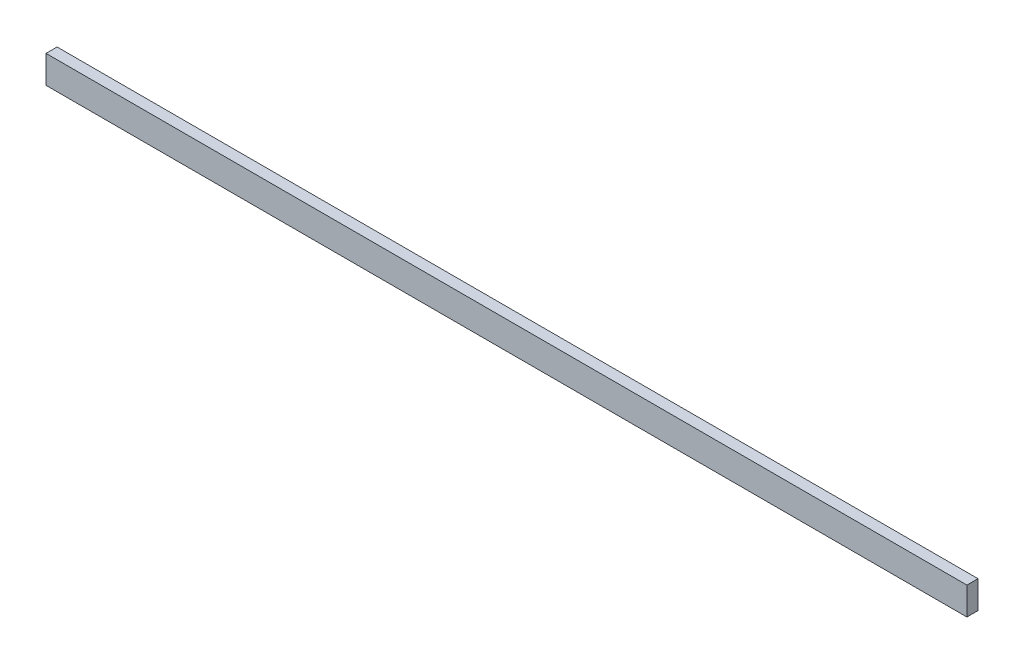
ISO-10303-21;
HEADER;
FILE_DESCRIPTION(('STEP AP214'),'2;1');
FILE_NAME('part.step','',(''),(''),'','','');
FILE_SCHEMA(('AUTOMOTIVE_DESIGN { 1 0 10303 214 1 1 1 1 }'));
ENDSEC;
DATA;
#1=APPLICATION_CONTEXT('core data for automotive mechanical design processes');
#2=APPLICATION_PROTOCOL_DEFINITION('international standard','automotive_design',2000,#1);
#3=PRODUCT_CONTEXT('',#1,'mechanical');
#4=PRODUCT('Part','Part','',(#3));
#5=PRODUCT_RELATED_PRODUCT_CATEGORY('part','',(#4));
#6=PRODUCT_DEFINITION_FORMATION('','',#4);
#7=PRODUCT_DEFINITION_CONTEXT('part definition',#1,'design');
#8=PRODUCT_DEFINITION('design','',#6,#7);
#9=PRODUCT_DEFINITION_SHAPE('','',#8);
#10=(LENGTH_UNIT() NAMED_UNIT(*) SI_UNIT(.MILLI.,.METRE.));
#11=(NAMED_UNIT(*) PLANE_ANGLE_UNIT() SI_UNIT($,.RADIAN.));
#12=(NAMED_UNIT(*) SI_UNIT($,.STERADIAN.) SOLID_ANGLE_UNIT());
#13=UNCERTAINTY_MEASURE_WITH_UNIT(LENGTH_MEASURE(1.E-05),#10,'distance_accuracy_value','');
#14=(GEOMETRIC_REPRESENTATION_CONTEXT(3) GLOBAL_UNCERTAINTY_ASSIGNED_CONTEXT((#13)) GLOBAL_UNIT_ASSIGNED_CONTEXT((#10,
#11,#12)) REPRESENTATION_CONTEXT('',''));
#15=CARTESIAN_POINT('',(0.,0.,0.));
#16=DIRECTION('',(0.,0.,1.));
#17=DIRECTION('',(1.,0.,0.));
#18=AXIS2_PLACEMENT_3D('',#15,#16,#17);
#19=CARTESIAN_POINT('',(332.5,-10.,8.));
#20=DIRECTION('',(-1.,0.,0.));
#21=DIRECTION('',(0.,0.,1.));
#22=AXIS2_PLACEMENT_3D('',#19,#20,#21);
#23=PLANE('',#22);
#24=DIRECTION('',(0.,1.,0.));
#25=VECTOR('',#24,1.);
#26=CARTESIAN_POINT('',(332.5,-10.,0.));
#27=LINE('',#26,#25);
#28=CARTESIAN_POINT('',(332.5,-10.,0.));
#29=VERTEX_POINT('',#28);
#30=CARTESIAN_POINT('',(332.5,10.,0.));
#31=VERTEX_POINT('',#30);
#32=EDGE_CURVE('E96',#29,#31,#27,.T.);
#33=ORIENTED_EDGE('',*,*,#32,.T.);
#34=DIRECTION('',(0.,0.,-1.));
#35=VECTOR('',#34,1.);
#36=CARTESIAN_POINT('',(332.5,10.,8.));
#37=LINE('',#36,#35);
#38=CARTESIAN_POINT('',(332.5,10.,8.));
#39=VERTEX_POINT('',#38);
#40=EDGE_CURVE('E11',#39,#31,#37,.T.);
#41=ORIENTED_EDGE('',*,*,#40,.F.);
#42=DIRECTION('',(0.,1.,0.));
#43=VECTOR('',#42,1.);
#44=CARTESIAN_POINT('',(332.5,-10.,8.));
#45=LINE('',#44,#43);
#46=CARTESIAN_POINT('',(332.5,-10.,8.));
#47=VERTEX_POINT('',#46);
#48=EDGE_CURVE('E84',#47,#39,#45,.T.);
#49=ORIENTED_EDGE('',*,*,#48,.F.);
#50=DIRECTION('',(0.,0.,-1.));
#51=VECTOR('',#50,1.);
#52=CARTESIAN_POINT('',(332.5,-10.,8.));
#53=LINE('',#52,#51);
#54=EDGE_CURVE('E92',#47,#29,#53,.T.);
#55=ORIENTED_EDGE('',*,*,#54,.T.);
#56=EDGE_LOOP('',(#33,#41,#49,#55));
#57=FACE_BOUND('',#56,.T.);
#58=ADVANCED_FACE('F33',(#57),#23,.F.);
#59=CARTESIAN_POINT('',(-332.5,10.,8.));
#60=DIRECTION('',(0.,-1.,0.));
#61=DIRECTION('',(0.,0.,-1.));
#62=AXIS2_PLACEMENT_3D('',#59,#60,#61);
#63=PLANE('',#62);
#64=DIRECTION('',(-1.,0.,0.));
#65=VECTOR('',#64,1.);
#66=CARTESIAN_POINT('',(-332.5,10.,0.));
#67=LINE('',#66,#65);
#68=CARTESIAN_POINT('',(-332.5,10.,0.));
#69=VERTEX_POINT('',#68);
#70=EDGE_CURVE('E88',#31,#69,#67,.T.);
#71=ORIENTED_EDGE('',*,*,#70,.T.);
#72=DIRECTION('',(0.,0.,-1.));
#73=VECTOR('',#72,1.);
#74=CARTESIAN_POINT('',(-332.5,10.,8.));
#75=LINE('',#74,#73);
#76=CARTESIAN_POINT('',(-332.5,10.,8.));
#77=VERTEX_POINT('',#76);
#78=EDGE_CURVE('E41',#77,#69,#75,.T.);
#79=ORIENTED_EDGE('',*,*,#78,.F.);
#80=DIRECTION('',(-1.,0.,0.));
#81=VECTOR('',#80,1.);
#82=CARTESIAN_POINT('',(-332.5,10.,8.));
#83=LINE('',#82,#81);
#84=EDGE_CURVE('E79',#39,#77,#83,.T.);
#85=ORIENTED_EDGE('',*,*,#84,.F.);
#86=ORIENTED_EDGE('',*,*,#40,.T.);
#87=EDGE_LOOP('',(#71,#79,#85,#86));
#88=FACE_BOUND('',#87,.T.);
#89=ADVANCED_FACE('F87',(#88),#63,.F.);
#90=CARTESIAN_POINT('',(-332.5,-10.,8.));
#91=DIRECTION('',(1.,0.,0.));
#92=DIRECTION('',(0.,0.,-1.));
#93=AXIS2_PLACEMENT_3D('',#90,#91,#92);
#94=PLANE('',#93);
#95=DIRECTION('',(0.,-1.,0.));
#96=VECTOR('',#95,1.);
#97=CARTESIAN_POINT('',(-332.5,-10.,0.));
#98=LINE('',#97,#96);
#99=CARTESIAN_POINT('',(-332.5,-10.,0.));
#100=VERTEX_POINT('',#99);
#101=EDGE_CURVE('E66',#69,#100,#98,.T.);
#102=ORIENTED_EDGE('',*,*,#101,.T.);
#103=DIRECTION('',(0.,0.,-1.));
#104=VECTOR('',#103,1.);
#105=CARTESIAN_POINT('',(-332.5,-10.,8.));
#106=LINE('',#105,#104);
#107=CARTESIAN_POINT('',(-332.5,-10.,8.));
#108=VERTEX_POINT('',#107);
#109=EDGE_CURVE('E89',#108,#100,#106,.T.);
#110=ORIENTED_EDGE('',*,*,#109,.F.);
#111=DIRECTION('',(0.,-1.,0.));
#112=VECTOR('',#111,1.);
#113=CARTESIAN_POINT('',(-332.5,-10.,8.));
#114=LINE('',#113,#112);
#115=EDGE_CURVE('E82',#77,#108,#114,.T.);
#116=ORIENTED_EDGE('',*,*,#115,.F.);
#117=ORIENTED_EDGE('',*,*,#78,.T.);
#118=EDGE_LOOP('',(#102,#110,#116,#117));
#119=FACE_BOUND('',#118,.T.);
#120=ADVANCED_FACE('F90',(#119),#94,.F.);
#121=CARTESIAN_POINT('',(-332.5,-10.,8.));
#122=DIRECTION('',(0.,1.,0.));
#123=DIRECTION('',(0.,0.,1.));
#124=AXIS2_PLACEMENT_3D('',#121,#122,#123);
#125=PLANE('',#124);
#126=DIRECTION('',(1.,0.,0.));
#127=VECTOR('',#126,1.);
#128=CARTESIAN_POINT('',(-332.5,-10.,0.));
#129=LINE('',#128,#127);
#130=EDGE_CURVE('E72',#100,#29,#129,.T.);
#131=ORIENTED_EDGE('',*,*,#130,.T.);
#132=ORIENTED_EDGE('',*,*,#54,.F.);
#133=DIRECTION('',(1.,0.,0.));
#134=VECTOR('',#133,1.);
#135=CARTESIAN_POINT('',(-332.5,-10.,8.));
#136=LINE('',#135,#134);
#137=EDGE_CURVE('E49',#108,#47,#136,.T.);
#138=ORIENTED_EDGE('',*,*,#137,.F.);
#139=ORIENTED_EDGE('',*,*,#109,.T.);
#140=EDGE_LOOP('',(#131,#132,#138,#139));
#141=FACE_BOUND('',#140,.T.);
#142=ADVANCED_FACE('F103',(#141),#125,.F.);
#143=CARTESIAN_POINT('',(0.,0.,8.));
#144=DIRECTION('',(0.,0.,-1.));
#145=DIRECTION('',(-1.,0.,0.));
#146=AXIS2_PLACEMENT_3D('',#143,#144,#145);
#147=PLANE('',#146);
#148=ORIENTED_EDGE('',*,*,#48,.T.);
#149=ORIENTED_EDGE('',*,*,#84,.T.);
#150=ORIENTED_EDGE('',*,*,#115,.T.);
#151=ORIENTED_EDGE('',*,*,#137,.T.);
#152=EDGE_LOOP('',(#148,#149,#150,#151));
#153=FACE_BOUND('',#152,.T.);
#154=ADVANCED_FACE('F80',(#153),#147,.F.);
#155=CARTESIAN_POINT('',(0.,0.,0.));
#156=DIRECTION('',(0.,0.,-1.));
#157=DIRECTION('',(-1.,0.,0.));
#158=AXIS2_PLACEMENT_3D('',#155,#156,#157);
#159=PLANE('',#158);
#160=ORIENTED_EDGE('',*,*,#32,.F.);
#161=ORIENTED_EDGE('',*,*,#130,.F.);
#162=ORIENTED_EDGE('',*,*,#101,.F.);
#163=ORIENTED_EDGE('',*,*,#70,.F.);
#164=EDGE_LOOP('',(#160,#161,#162,#163));
#165=FACE_BOUND('',#164,.T.);
#166=ADVANCED_FACE('F106',(#165),#159,.T.);
#167=CLOSED_SHELL('',(#58,#89,#120,#142,#154,#166));
#168=MANIFOLD_SOLID_BREP('B2',#167);
#169=ADVANCED_BREP_SHAPE_REPRESENTATION('',(#18,#168),#14);
#170=SHAPE_DEFINITION_REPRESENTATION(#9,#169);
ENDSEC;
END-ISO-10303-21;
